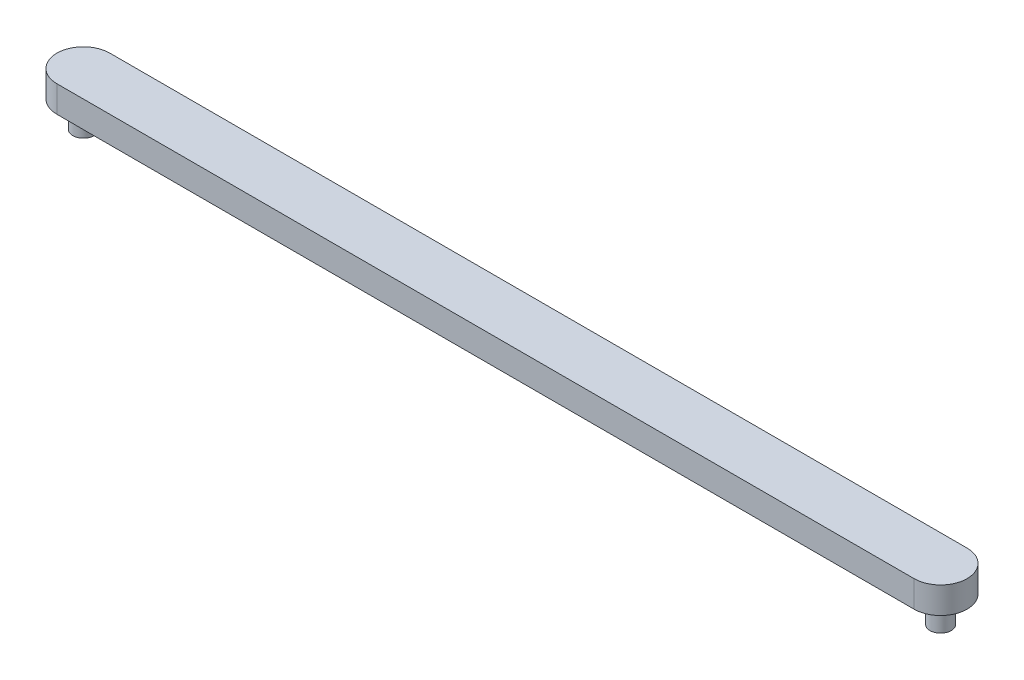
ISO-10303-21;
HEADER;
FILE_DESCRIPTION(('STEP AP214'),'2;1');
FILE_NAME('part.step','',(''),(''),'','','');
FILE_SCHEMA(('AUTOMOTIVE_DESIGN { 1 0 10303 214 1 1 1 1 }'));
ENDSEC;
DATA;
#1=APPLICATION_CONTEXT('core data for automotive mechanical design processes');
#2=APPLICATION_PROTOCOL_DEFINITION('international standard','automotive_design',2000,#1);
#3=PRODUCT_CONTEXT('',#1,'mechanical');
#4=PRODUCT('Part','Part','',(#3));
#5=PRODUCT_RELATED_PRODUCT_CATEGORY('part','',(#4));
#6=PRODUCT_DEFINITION_FORMATION('','',#4);
#7=PRODUCT_DEFINITION_CONTEXT('part definition',#1,'design');
#8=PRODUCT_DEFINITION('design','',#6,#7);
#9=PRODUCT_DEFINITION_SHAPE('','',#8);
#10=(LENGTH_UNIT() NAMED_UNIT(*) SI_UNIT(.MILLI.,.METRE.));
#11=(NAMED_UNIT(*) PLANE_ANGLE_UNIT() SI_UNIT($,.RADIAN.));
#12=(NAMED_UNIT(*) SI_UNIT($,.STERADIAN.) SOLID_ANGLE_UNIT());
#13=UNCERTAINTY_MEASURE_WITH_UNIT(LENGTH_MEASURE(1.E-05),#10,'distance_accuracy_value','');
#14=(GEOMETRIC_REPRESENTATION_CONTEXT(3) GLOBAL_UNCERTAINTY_ASSIGNED_CONTEXT((#13)) GLOBAL_UNIT_ASSIGNED_CONTEXT((#10,
#11,#12)) REPRESENTATION_CONTEXT('',''));
#15=CARTESIAN_POINT('',(0.,0.,0.));
#16=DIRECTION('',(0.,0.,1.));
#17=DIRECTION('',(1.,0.,0.));
#18=AXIS2_PLACEMENT_3D('',#15,#16,#17);
#19=CARTESIAN_POINT('',(0.,41.5,185.25));
#20=DIRECTION('',(0.,0.,-1.));
#21=DIRECTION('',(-1.,0.,0.));
#22=AXIS2_PLACEMENT_3D('',#19,#20,#21);
#23=PLANE('',#22);
#24=DIRECTION('',(0.,1.,0.));
#25=VECTOR('',#24,1.);
#26=CARTESIAN_POINT('',(-115.660621761658,41.5,185.25));
#27=LINE('',#26,#25);
#28=CARTESIAN_POINT('',(-115.660621761658,41.5,185.25));
#29=VERTEX_POINT('',#28);
#30=CARTESIAN_POINT('',(-115.660621761658,46.5,185.25));
#31=VERTEX_POINT('',#30);
#32=EDGE_CURVE('E86',#29,#31,#27,.T.);
#33=ORIENTED_EDGE('',*,*,#32,.T.);
#34=DIRECTION('',(-1.,0.,0.));
#35=VECTOR('',#34,1.);
#36=CARTESIAN_POINT('',(0.,46.5,185.25));
#37=LINE('',#36,#35);
#38=CARTESIAN_POINT('',(46.1606217616581,46.5,185.25));
#39=VERTEX_POINT('',#38);
#40=EDGE_CURVE('E89',#39,#31,#37,.T.);
#41=ORIENTED_EDGE('',*,*,#40,.F.);
#42=DIRECTION('',(0.,1.,0.));
#43=VECTOR('',#42,1.);
#44=CARTESIAN_POINT('',(46.1606217616581,41.5,185.25));
#45=LINE('',#44,#43);
#46=CARTESIAN_POINT('',(46.1606217616581,41.5,185.25));
#47=VERTEX_POINT('',#46);
#48=EDGE_CURVE('E11',#47,#39,#45,.T.);
#49=ORIENTED_EDGE('',*,*,#48,.F.);
#50=DIRECTION('',(-1.,0.,0.));
#51=VECTOR('',#50,1.);
#52=CARTESIAN_POINT('',(0.,41.5,185.25));
#53=LINE('',#52,#51);
#54=EDGE_CURVE('E90',#47,#29,#53,.T.);
#55=ORIENTED_EDGE('',*,*,#54,.T.);
#56=EDGE_LOOP('',(#33,#41,#49,#55));
#57=FACE_BOUND('',#56,.T.);
#58=ADVANCED_FACE('F47',(#57),#23,.T.);
#59=CARTESIAN_POINT('',(46.1606217616581,41.5,190.25));
#60=DIRECTION('',(0.,1.,0.));
#61=DIRECTION('',(0.,0.,1.));
#62=AXIS2_PLACEMENT_3D('',#59,#60,#61);
#63=CYLINDRICAL_SURFACE('',#62,5.00000000000002);
#64=ORIENTED_EDGE('',*,*,#48,.T.);
#65=CARTESIAN_POINT('',(46.1606217616581,46.5,190.25));
#66=DIRECTION('',(0.,1.,0.));
#67=DIRECTION('',(0.,0.,1.));
#68=AXIS2_PLACEMENT_3D('',#65,#66,#67);
#69=CIRCLE('',#68,5.00000000000002);
#70=CARTESIAN_POINT('',(46.1606217616581,46.5,195.25));
#71=VERTEX_POINT('',#70);
#72=EDGE_CURVE('E109',#71,#39,#69,.T.);
#73=ORIENTED_EDGE('',*,*,#72,.F.);
#74=DIRECTION('',(0.,1.,0.));
#75=VECTOR('',#74,1.);
#76=CARTESIAN_POINT('',(46.1606217616581,41.5,195.25));
#77=LINE('',#76,#75);
#78=CARTESIAN_POINT('',(46.1606217616581,41.5,195.25));
#79=VERTEX_POINT('',#78);
#80=EDGE_CURVE('E56',#79,#71,#77,.T.);
#81=ORIENTED_EDGE('',*,*,#80,.F.);
#82=CARTESIAN_POINT('',(46.1606217616581,41.5,190.25));
#83=DIRECTION('',(0.,1.,0.));
#84=DIRECTION('',(0.,0.,1.));
#85=AXIS2_PLACEMENT_3D('',#82,#83,#84);
#86=CIRCLE('',#85,5.00000000000002);
#87=EDGE_CURVE('E96',#79,#47,#86,.T.);
#88=ORIENTED_EDGE('',*,*,#87,.T.);
#89=EDGE_LOOP('',(#64,#73,#81,#88));
#90=FACE_BOUND('',#89,.T.);
#91=ADVANCED_FACE('F140',(#90),#63,.T.);
#92=CARTESIAN_POINT('',(0.,41.5,195.25));
#93=DIRECTION('',(0.,0.,1.));
#94=DIRECTION('',(1.,0.,0.));
#95=AXIS2_PLACEMENT_3D('',#92,#93,#94);
#96=PLANE('',#95);
#97=ORIENTED_EDGE('',*,*,#80,.T.);
#98=DIRECTION('',(1.,0.,0.));
#99=VECTOR('',#98,1.);
#100=CARTESIAN_POINT('',(0.,46.5,195.25));
#101=LINE('',#100,#99);
#102=CARTESIAN_POINT('',(-115.660621761658,46.5,195.25));
#103=VERTEX_POINT('',#102);
#104=EDGE_CURVE('E105',#103,#71,#101,.T.);
#105=ORIENTED_EDGE('',*,*,#104,.F.);
#106=DIRECTION('',(0.,1.,0.));
#107=VECTOR('',#106,1.);
#108=CARTESIAN_POINT('',(-115.660621761658,41.5,195.25));
#109=LINE('',#108,#107);
#110=CARTESIAN_POINT('',(-115.660621761658,41.5,195.25));
#111=VERTEX_POINT('',#110);
#112=EDGE_CURVE('E95',#111,#103,#109,.T.);
#113=ORIENTED_EDGE('',*,*,#112,.F.);
#114=DIRECTION('',(1.,0.,0.));
#115=VECTOR('',#114,1.);
#116=CARTESIAN_POINT('',(0.,41.5,195.25));
#117=LINE('',#116,#115);
#118=EDGE_CURVE('E128',#111,#79,#117,.T.);
#119=ORIENTED_EDGE('',*,*,#118,.T.);
#120=EDGE_LOOP('',(#97,#105,#113,#119));
#121=FACE_BOUND('',#120,.T.);
#122=ADVANCED_FACE('F137',(#121),#96,.T.);
#123=CARTESIAN_POINT('',(-115.660621761658,41.5,190.25));
#124=DIRECTION('',(0.,1.,0.));
#125=DIRECTION('',(0.,0.,1.));
#126=AXIS2_PLACEMENT_3D('',#123,#124,#125);
#127=CYLINDRICAL_SURFACE('',#126,4.99999999999999);
#128=ORIENTED_EDGE('',*,*,#112,.T.);
#129=CARTESIAN_POINT('',(-115.660621761658,46.5,190.25));
#130=DIRECTION('',(0.,1.,0.));
#131=DIRECTION('',(0.,0.,1.));
#132=AXIS2_PLACEMENT_3D('',#129,#130,#131);
#133=CIRCLE('',#132,4.99999999999999);
#134=EDGE_CURVE('E99',#31,#103,#133,.T.);
#135=ORIENTED_EDGE('',*,*,#134,.F.);
#136=ORIENTED_EDGE('',*,*,#32,.F.);
#137=CARTESIAN_POINT('',(-115.660621761658,41.5,190.25));
#138=DIRECTION('',(0.,1.,0.));
#139=DIRECTION('',(0.,0.,1.));
#140=AXIS2_PLACEMENT_3D('',#137,#138,#139);
#141=CIRCLE('',#140,4.99999999999999);
#142=EDGE_CURVE('E125',#29,#111,#141,.T.);
#143=ORIENTED_EDGE('',*,*,#142,.T.);
#144=EDGE_LOOP('',(#128,#135,#136,#143));
#145=FACE_BOUND('',#144,.T.);
#146=ADVANCED_FACE('F100',(#145),#127,.T.);
#147=CARTESIAN_POINT('',(0.,41.5,0.));
#148=DIRECTION('',(0.,1.,0.));
#149=DIRECTION('',(0.,0.,1.));
#150=AXIS2_PLACEMENT_3D('',#147,#148,#149);
#151=PLANE('',#150);
#152=CARTESIAN_POINT('',(-115.660621761658,41.5,190.25));
#153=DIRECTION('',(0.,1.,0.));
#154=DIRECTION('',(0.,0.,1.));
#155=AXIS2_PLACEMENT_3D('',#152,#153,#154);
#156=CIRCLE('',#155,2.);
#157=CARTESIAN_POINT('',(-115.660621761658,41.5,192.25));
#158=VERTEX_POINT('',#157);
#159=EDGE_CURVE('E50',#158,#158,#156,.T.);
#160=ORIENTED_EDGE('',*,*,#159,.T.);
#161=EDGE_LOOP('',(#160));
#162=FACE_BOUND('',#161,.T.);
#163=CARTESIAN_POINT('',(46.1606217616581,41.5,190.25));
#164=DIRECTION('',(0.,1.,0.));
#165=DIRECTION('',(0.,0.,1.));
#166=AXIS2_PLACEMENT_3D('',#163,#164,#165);
#167=CIRCLE('',#166,2.);
#168=CARTESIAN_POINT('',(46.1606217616581,41.5,192.25));
#169=VERTEX_POINT('',#168);
#170=EDGE_CURVE('E111',#169,#169,#167,.T.);
#171=ORIENTED_EDGE('',*,*,#170,.T.);
#172=EDGE_LOOP('',(#171));
#173=FACE_BOUND('',#172,.T.);
#174=ORIENTED_EDGE('',*,*,#54,.F.);
#175=ORIENTED_EDGE('',*,*,#87,.F.);
#176=ORIENTED_EDGE('',*,*,#118,.F.);
#177=ORIENTED_EDGE('',*,*,#142,.F.);
#178=EDGE_LOOP('',(#174,#175,#176,#177));
#179=FACE_BOUND('',#178,.T.);
#180=ADVANCED_FACE('F142',(#162,#173,#179),#151,.F.);
#181=CARTESIAN_POINT('',(0.,46.5,0.));
#182=DIRECTION('',(0.,1.,0.));
#183=DIRECTION('',(0.,0.,1.));
#184=AXIS2_PLACEMENT_3D('',#181,#182,#183);
#185=PLANE('',#184);
#186=ORIENTED_EDGE('',*,*,#40,.T.);
#187=ORIENTED_EDGE('',*,*,#134,.T.);
#188=ORIENTED_EDGE('',*,*,#104,.T.);
#189=ORIENTED_EDGE('',*,*,#72,.T.);
#190=EDGE_LOOP('',(#186,#187,#188,#189));
#191=FACE_BOUND('',#190,.T.);
#192=ADVANCED_FACE('F108',(#191),#185,.T.);
#193=CARTESIAN_POINT('',(46.1606217616581,36.5,190.25));
#194=DIRECTION('',(0.,1.,0.));
#195=DIRECTION('',(0.,0.,1.));
#196=AXIS2_PLACEMENT_3D('',#193,#194,#195);
#197=CYLINDRICAL_SURFACE('',#196,2.);
#198=CARTESIAN_POINT('',(46.1606217616581,36.5,190.25));
#199=DIRECTION('',(0.,1.,0.));
#200=DIRECTION('',(0.,0.,1.));
#201=AXIS2_PLACEMENT_3D('',#198,#199,#200);
#202=CIRCLE('',#201,2.);
#203=CARTESIAN_POINT('',(46.1606217616581,36.5,192.25));
#204=VERTEX_POINT('',#203);
#205=EDGE_CURVE('E115',#204,#204,#202,.T.);
#206=ORIENTED_EDGE('',*,*,#205,.T.);
#207=EDGE_LOOP('',(#206));
#208=FACE_BOUND('',#207,.T.);
#209=ORIENTED_EDGE('',*,*,#170,.F.);
#210=EDGE_LOOP('',(#209));
#211=FACE_BOUND('',#210,.T.);
#212=ADVANCED_FACE('F151',(#208,#211),#197,.T.);
#213=CARTESIAN_POINT('',(0.,36.5,0.));
#214=DIRECTION('',(0.,1.,0.));
#215=DIRECTION('',(0.,0.,1.));
#216=AXIS2_PLACEMENT_3D('',#213,#214,#215);
#217=PLANE('',#216);
#218=ORIENTED_EDGE('',*,*,#205,.F.);
#219=EDGE_LOOP('',(#218));
#220=FACE_BOUND('',#219,.T.);
#221=ADVANCED_FACE('F192',(#220),#217,.F.);
#222=CARTESIAN_POINT('',(-115.660621761658,36.5,190.25));
#223=DIRECTION('',(0.,1.,0.));
#224=DIRECTION('',(0.,0.,1.));
#225=AXIS2_PLACEMENT_3D('',#222,#223,#224);
#226=CYLINDRICAL_SURFACE('',#225,2.);
#227=CARTESIAN_POINT('',(-115.660621761658,36.5,190.25));
#228=DIRECTION('',(0.,1.,0.));
#229=DIRECTION('',(0.,0.,1.));
#230=AXIS2_PLACEMENT_3D('',#227,#228,#229);
#231=CIRCLE('',#230,2.);
#232=CARTESIAN_POINT('',(-115.660621761658,36.5,192.25));
#233=VERTEX_POINT('',#232);
#234=EDGE_CURVE('E230',#233,#233,#231,.T.);
#235=ORIENTED_EDGE('',*,*,#234,.T.);
#236=EDGE_LOOP('',(#235));
#237=FACE_BOUND('',#236,.T.);
#238=ORIENTED_EDGE('',*,*,#159,.F.);
#239=EDGE_LOOP('',(#238));
#240=FACE_BOUND('',#239,.T.);
#241=ADVANCED_FACE('F200',(#237,#240),#226,.T.);
#242=CARTESIAN_POINT('',(-115.660621761658,36.5,190.25));
#243=DIRECTION('',(0.,1.,0.));
#244=DIRECTION('',(0.,0.,1.));
#245=AXIS2_PLACEMENT_3D('',#242,#243,#244);
#246=PLANE('',#245);
#247=ORIENTED_EDGE('',*,*,#234,.F.);
#248=EDGE_LOOP('',(#247));
#249=FACE_BOUND('',#248,.T.);
#250=ADVANCED_FACE('F208',(#249),#246,.F.);
#251=CLOSED_SHELL('',(#58,#91,#122,#146,#180,#192,#212,#221,#241,#250));
#252=MANIFOLD_SOLID_BREP('B2',#251);
#253=ADVANCED_BREP_SHAPE_REPRESENTATION('',(#18,#252),#14);
#254=SHAPE_DEFINITION_REPRESENTATION(#9,#253);
ENDSEC;
END-ISO-10303-21;
